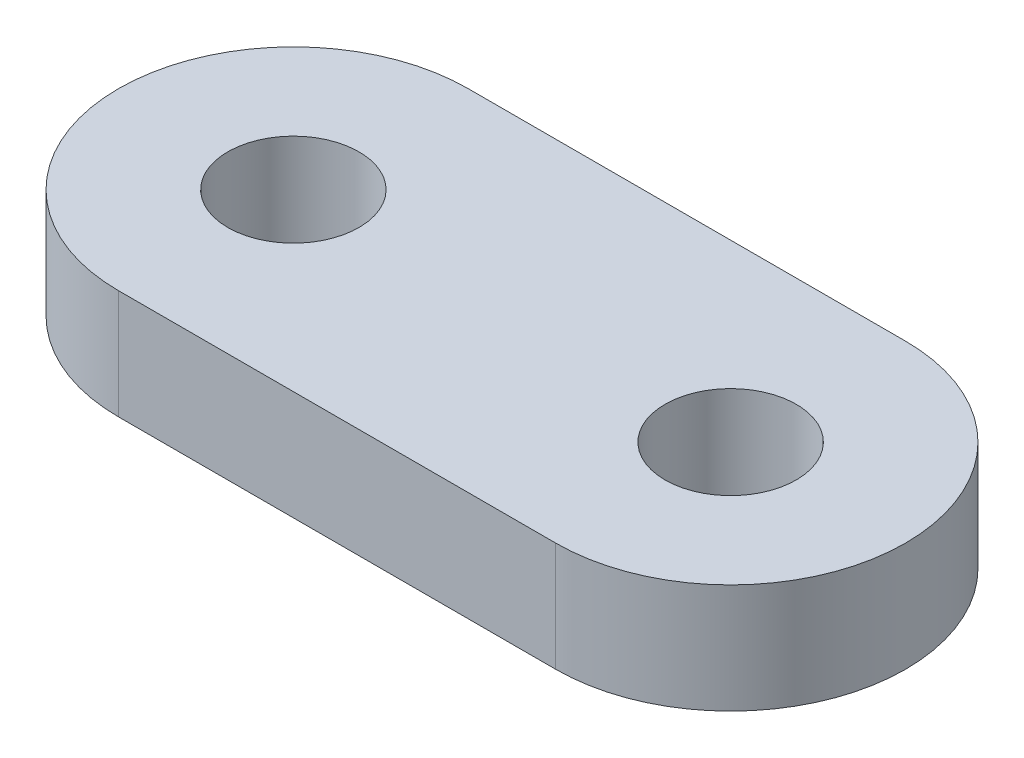
ISO-10303-21;
HEADER;
FILE_DESCRIPTION(('STEP AP214'),'2;1');
FILE_NAME('part.step','',(''),(''),'','','');
FILE_SCHEMA(('AUTOMOTIVE_DESIGN { 1 0 10303 214 1 1 1 1 }'));
ENDSEC;
DATA;
#1=APPLICATION_CONTEXT('core data for automotive mechanical design processes');
#2=APPLICATION_PROTOCOL_DEFINITION('international standard','automotive_design',2000,#1);
#3=PRODUCT_CONTEXT('',#1,'mechanical');
#4=PRODUCT('Part','Part','',(#3));
#5=PRODUCT_RELATED_PRODUCT_CATEGORY('part','',(#4));
#6=PRODUCT_DEFINITION_FORMATION('','',#4);
#7=PRODUCT_DEFINITION_CONTEXT('part definition',#1,'design');
#8=PRODUCT_DEFINITION('design','',#6,#7);
#9=PRODUCT_DEFINITION_SHAPE('','',#8);
#10=(LENGTH_UNIT() NAMED_UNIT(*) SI_UNIT(.MILLI.,.METRE.));
#11=(NAMED_UNIT(*) PLANE_ANGLE_UNIT() SI_UNIT($,.RADIAN.));
#12=(NAMED_UNIT(*) SI_UNIT($,.STERADIAN.) SOLID_ANGLE_UNIT());
#13=UNCERTAINTY_MEASURE_WITH_UNIT(LENGTH_MEASURE(1.E-05),#10,'distance_accuracy_value','');
#14=(GEOMETRIC_REPRESENTATION_CONTEXT(3) GLOBAL_UNCERTAINTY_ASSIGNED_CONTEXT((#13)) GLOBAL_UNIT_ASSIGNED_CONTEXT((#10,
#11,#12)) REPRESENTATION_CONTEXT('',''));
#15=CARTESIAN_POINT('',(0.,0.,0.));
#16=DIRECTION('',(0.,0.,1.));
#17=DIRECTION('',(1.,0.,0.));
#18=AXIS2_PLACEMENT_3D('',#15,#16,#17);
#19=CARTESIAN_POINT('',(-10.,5.,0.));
#20=DIRECTION('',(0.,1.,0.));
#21=DIRECTION('',(0.,0.,1.));
#22=AXIS2_PLACEMENT_3D('',#19,#20,#21);
#23=PLANE('',#22);
#24=CARTESIAN_POINT('',(-10.,5.,0.));
#25=DIRECTION('',(0.,1.,0.));
#26=DIRECTION('',(0.,0.,1.));
#27=AXIS2_PLACEMENT_3D('',#24,#25,#26);
#28=CIRCLE('',#27,3.);
#29=CARTESIAN_POINT('',(-10.,5.,3.));
#30=VERTEX_POINT('',#29);
#31=EDGE_CURVE('E103',#30,#30,#28,.T.);
#32=ORIENTED_EDGE('',*,*,#31,.F.);
#33=EDGE_LOOP('',(#32));
#34=FACE_BOUND('',#33,.T.);
#35=CARTESIAN_POINT('',(-10.,5.,0.));
#36=DIRECTION('',(0.,1.,0.));
#37=DIRECTION('',(0.,0.,1.));
#38=AXIS2_PLACEMENT_3D('',#35,#36,#37);
#39=CIRCLE('',#38,8.);
#40=CARTESIAN_POINT('',(-10.,5.,-8.));
#41=VERTEX_POINT('',#40);
#42=CARTESIAN_POINT('',(-10.,5.,8.));
#43=VERTEX_POINT('',#42);
#44=EDGE_CURVE('E88',#41,#43,#39,.T.);
#45=ORIENTED_EDGE('',*,*,#44,.T.);
#46=DIRECTION('',(1.,0.,0.));
#47=VECTOR('',#46,1.);
#48=CARTESIAN_POINT('',(-10.,5.,8.));
#49=LINE('',#48,#47);
#50=CARTESIAN_POINT('',(10.,5.,8.));
#51=VERTEX_POINT('',#50);
#52=EDGE_CURVE('E83',#43,#51,#49,.T.);
#53=ORIENTED_EDGE('',*,*,#52,.T.);
#54=CARTESIAN_POINT('',(10.,5.,0.));
#55=DIRECTION('',(0.,1.,0.));
#56=DIRECTION('',(0.,0.,1.));
#57=AXIS2_PLACEMENT_3D('',#54,#55,#56);
#58=CIRCLE('',#57,8.);
#59=CARTESIAN_POINT('',(9.99999999999999,5.,-8.00000000000001));
#60=VERTEX_POINT('',#59);
#61=EDGE_CURVE('E86',#51,#60,#58,.T.);
#62=ORIENTED_EDGE('',*,*,#61,.T.);
#63=DIRECTION('',(-1.,0.,0.));
#64=VECTOR('',#63,1.);
#65=CARTESIAN_POINT('',(-10.,5.,-8.));
#66=LINE('',#65,#64);
#67=EDGE_CURVE('E53',#60,#41,#66,.T.);
#68=ORIENTED_EDGE('',*,*,#67,.T.);
#69=EDGE_LOOP('',(#45,#53,#62,#68));
#70=FACE_BOUND('',#69,.T.);
#71=CARTESIAN_POINT('',(10.,5.,0.));
#72=DIRECTION('',(0.,1.,0.));
#73=DIRECTION('',(0.,0.,1.));
#74=AXIS2_PLACEMENT_3D('',#71,#72,#73);
#75=CIRCLE('',#74,3.);
#76=CARTESIAN_POINT('',(10.,5.,2.99999999999999));
#77=VERTEX_POINT('',#76);
#78=EDGE_CURVE('E118',#77,#77,#75,.T.);
#79=ORIENTED_EDGE('',*,*,#78,.F.);
#80=EDGE_LOOP('',(#79));
#81=FACE_BOUND('',#80,.T.);
#82=ADVANCED_FACE('F36',(#34,#70,#81),#23,.T.);
#83=CARTESIAN_POINT('',(-10.,0.,0.));
#84=DIRECTION('',(0.,1.,0.));
#85=DIRECTION('',(0.,0.,1.));
#86=AXIS2_PLACEMENT_3D('',#83,#84,#85);
#87=PLANE('',#86);
#88=CARTESIAN_POINT('',(-10.,0.,0.));
#89=DIRECTION('',(0.,1.,0.));
#90=DIRECTION('',(0.,0.,1.));
#91=AXIS2_PLACEMENT_3D('',#88,#89,#90);
#92=CIRCLE('',#91,8.);
#93=CARTESIAN_POINT('',(-10.,0.,-8.));
#94=VERTEX_POINT('',#93);
#95=CARTESIAN_POINT('',(-10.,0.,8.));
#96=VERTEX_POINT('',#95);
#97=EDGE_CURVE('E100',#94,#96,#92,.T.);
#98=ORIENTED_EDGE('',*,*,#97,.F.);
#99=DIRECTION('',(-1.,0.,0.));
#100=VECTOR('',#99,1.);
#101=CARTESIAN_POINT('',(-10.,0.,-8.));
#102=LINE('',#101,#100);
#103=CARTESIAN_POINT('',(9.99999999999999,0.,-8.00000000000001));
#104=VERTEX_POINT('',#103);
#105=EDGE_CURVE('E76',#104,#94,#102,.T.);
#106=ORIENTED_EDGE('',*,*,#105,.F.);
#107=CARTESIAN_POINT('',(10.,0.,0.));
#108=DIRECTION('',(0.,1.,0.));
#109=DIRECTION('',(0.,0.,1.));
#110=AXIS2_PLACEMENT_3D('',#107,#108,#109);
#111=CIRCLE('',#110,8.);
#112=CARTESIAN_POINT('',(10.,0.,8.));
#113=VERTEX_POINT('',#112);
#114=EDGE_CURVE('E70',#113,#104,#111,.T.);
#115=ORIENTED_EDGE('',*,*,#114,.F.);
#116=DIRECTION('',(1.,0.,0.));
#117=VECTOR('',#116,1.);
#118=CARTESIAN_POINT('',(-10.,0.,8.));
#119=LINE('',#118,#117);
#120=EDGE_CURVE('E92',#96,#113,#119,.T.);
#121=ORIENTED_EDGE('',*,*,#120,.F.);
#122=EDGE_LOOP('',(#98,#106,#115,#121));
#123=FACE_BOUND('',#122,.T.);
#124=CARTESIAN_POINT('',(-10.,0.,0.));
#125=DIRECTION('',(0.,1.,0.));
#126=DIRECTION('',(0.,0.,1.));
#127=AXIS2_PLACEMENT_3D('',#124,#125,#126);
#128=CIRCLE('',#127,3.);
#129=CARTESIAN_POINT('',(-10.,0.,3.));
#130=VERTEX_POINT('',#129);
#131=EDGE_CURVE('E115',#130,#130,#128,.T.);
#132=ORIENTED_EDGE('',*,*,#131,.T.);
#133=EDGE_LOOP('',(#132));
#134=FACE_BOUND('',#133,.T.);
#135=CARTESIAN_POINT('',(10.,0.,0.));
#136=DIRECTION('',(0.,1.,0.));
#137=DIRECTION('',(0.,0.,1.));
#138=AXIS2_PLACEMENT_3D('',#135,#136,#137);
#139=CIRCLE('',#138,3.);
#140=CARTESIAN_POINT('',(10.,0.,2.99999999999999));
#141=VERTEX_POINT('',#140);
#142=EDGE_CURVE('E121',#141,#141,#139,.T.);
#143=ORIENTED_EDGE('',*,*,#142,.T.);
#144=EDGE_LOOP('',(#143));
#145=FACE_BOUND('',#144,.T.);
#146=ADVANCED_FACE('F111',(#123,#134,#145),#87,.F.);
#147=CARTESIAN_POINT('',(-10.,5.,0.));
#148=DIRECTION('',(0.,-1.,0.));
#149=DIRECTION('',(0.,0.,-1.));
#150=AXIS2_PLACEMENT_3D('',#147,#148,#149);
#151=CYLINDRICAL_SURFACE('',#150,8.);
#152=ORIENTED_EDGE('',*,*,#97,.T.);
#153=DIRECTION('',(0.,-1.,0.));
#154=VECTOR('',#153,1.);
#155=CARTESIAN_POINT('',(-10.,5.,8.));
#156=LINE('',#155,#154);
#157=EDGE_CURVE('E11',#43,#96,#156,.T.);
#158=ORIENTED_EDGE('',*,*,#157,.F.);
#159=ORIENTED_EDGE('',*,*,#44,.F.);
#160=DIRECTION('',(0.,-1.,0.));
#161=VECTOR('',#160,1.);
#162=CARTESIAN_POINT('',(-10.,5.,-8.));
#163=LINE('',#162,#161);
#164=EDGE_CURVE('E96',#41,#94,#163,.T.);
#165=ORIENTED_EDGE('',*,*,#164,.T.);
#166=EDGE_LOOP('',(#152,#158,#159,#165));
#167=FACE_BOUND('',#166,.T.);
#168=ADVANCED_FACE('F38',(#167),#151,.T.);
#169=CARTESIAN_POINT('',(-10.,5.,8.));
#170=DIRECTION('',(0.,0.,-1.));
#171=DIRECTION('',(-1.,0.,0.));
#172=AXIS2_PLACEMENT_3D('',#169,#170,#171);
#173=PLANE('',#172);
#174=ORIENTED_EDGE('',*,*,#120,.T.);
#175=DIRECTION('',(0.,-1.,0.));
#176=VECTOR('',#175,1.);
#177=CARTESIAN_POINT('',(10.,5.,8.));
#178=LINE('',#177,#176);
#179=EDGE_CURVE('E45',#51,#113,#178,.T.);
#180=ORIENTED_EDGE('',*,*,#179,.F.);
#181=ORIENTED_EDGE('',*,*,#52,.F.);
#182=ORIENTED_EDGE('',*,*,#157,.T.);
#183=EDGE_LOOP('',(#174,#180,#181,#182));
#184=FACE_BOUND('',#183,.T.);
#185=ADVANCED_FACE('F91',(#184),#173,.F.);
#186=CARTESIAN_POINT('',(10.,5.,0.));
#187=DIRECTION('',(0.,-1.,0.));
#188=DIRECTION('',(0.,0.,-1.));
#189=AXIS2_PLACEMENT_3D('',#186,#187,#188);
#190=CYLINDRICAL_SURFACE('',#189,8.);
#191=ORIENTED_EDGE('',*,*,#114,.T.);
#192=DIRECTION('',(0.,-1.,0.));
#193=VECTOR('',#192,1.);
#194=CARTESIAN_POINT('',(9.99999999999999,5.,-8.00000000000001));
#195=LINE('',#194,#193);
#196=EDGE_CURVE('E93',#60,#104,#195,.T.);
#197=ORIENTED_EDGE('',*,*,#196,.F.);
#198=ORIENTED_EDGE('',*,*,#61,.F.);
#199=ORIENTED_EDGE('',*,*,#179,.T.);
#200=EDGE_LOOP('',(#191,#197,#198,#199));
#201=FACE_BOUND('',#200,.T.);
#202=ADVANCED_FACE('F94',(#201),#190,.T.);
#203=CARTESIAN_POINT('',(-10.,5.,-8.));
#204=DIRECTION('',(0.,0.,1.));
#205=DIRECTION('',(1.,0.,0.));
#206=AXIS2_PLACEMENT_3D('',#203,#204,#205);
#207=PLANE('',#206);
#208=ORIENTED_EDGE('',*,*,#105,.T.);
#209=ORIENTED_EDGE('',*,*,#164,.F.);
#210=ORIENTED_EDGE('',*,*,#67,.F.);
#211=ORIENTED_EDGE('',*,*,#196,.T.);
#212=EDGE_LOOP('',(#208,#209,#210,#211));
#213=FACE_BOUND('',#212,.T.);
#214=ADVANCED_FACE('F108',(#213),#207,.F.);
#215=CARTESIAN_POINT('',(-10.,5.,0.));
#216=DIRECTION('',(0.,-1.,0.));
#217=DIRECTION('',(0.,0.,-1.));
#218=AXIS2_PLACEMENT_3D('',#215,#216,#217);
#219=CYLINDRICAL_SURFACE('',#218,3.);
#220=ORIENTED_EDGE('',*,*,#31,.T.);
#221=EDGE_LOOP('',(#220));
#222=FACE_BOUND('',#221,.T.);
#223=ORIENTED_EDGE('',*,*,#131,.F.);
#224=EDGE_LOOP('',(#223));
#225=FACE_BOUND('',#224,.T.);
#226=ADVANCED_FACE('F138',(#222,#225),#219,.F.);
#227=CARTESIAN_POINT('',(10.,5.,0.));
#228=DIRECTION('',(0.,-1.,0.));
#229=DIRECTION('',(0.,0.,-1.));
#230=AXIS2_PLACEMENT_3D('',#227,#228,#229);
#231=CYLINDRICAL_SURFACE('',#230,3.);
#232=ORIENTED_EDGE('',*,*,#78,.T.);
#233=EDGE_LOOP('',(#232));
#234=FACE_BOUND('',#233,.T.);
#235=ORIENTED_EDGE('',*,*,#142,.F.);
#236=EDGE_LOOP('',(#235));
#237=FACE_BOUND('',#236,.T.);
#238=ADVANCED_FACE('F127',(#234,#237),#231,.F.);
#239=CLOSED_SHELL('',(#82,#146,#168,#185,#202,#214,#226,#238));
#240=MANIFOLD_SOLID_BREP('B2',#239);
#241=ADVANCED_BREP_SHAPE_REPRESENTATION('',(#18,#240),#14);
#242=SHAPE_DEFINITION_REPRESENTATION(#9,#241);
ENDSEC;
END-ISO-10303-21;
